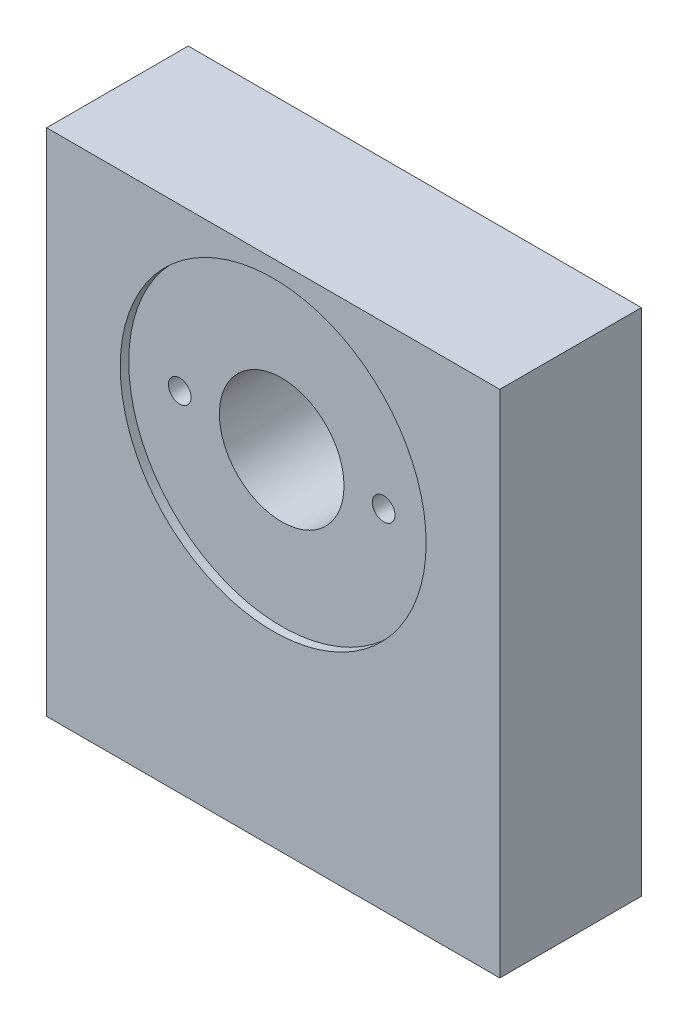
ISO-10303-21;
HEADER;
FILE_DESCRIPTION(('STEP AP214'),'2;1');
FILE_NAME('part.step','',(''),(''),'','','');
FILE_SCHEMA(('AUTOMOTIVE_DESIGN { 1 0 10303 214 1 1 1 1 }'));
ENDSEC;
DATA;
#1=APPLICATION_CONTEXT('core data for automotive mechanical design processes');
#2=APPLICATION_PROTOCOL_DEFINITION('international standard','automotive_design',2000,#1);
#3=PRODUCT_CONTEXT('',#1,'mechanical');
#4=PRODUCT('Part','Part','',(#3));
#5=PRODUCT_RELATED_PRODUCT_CATEGORY('part','',(#4));
#6=PRODUCT_DEFINITION_FORMATION('','',#4);
#7=PRODUCT_DEFINITION_CONTEXT('part definition',#1,'design');
#8=PRODUCT_DEFINITION('design','',#6,#7);
#9=PRODUCT_DEFINITION_SHAPE('','',#8);
#10=(LENGTH_UNIT() NAMED_UNIT(*) SI_UNIT(.MILLI.,.METRE.));
#11=(NAMED_UNIT(*) PLANE_ANGLE_UNIT() SI_UNIT($,.RADIAN.));
#12=(NAMED_UNIT(*) SI_UNIT($,.STERADIAN.) SOLID_ANGLE_UNIT());
#13=UNCERTAINTY_MEASURE_WITH_UNIT(LENGTH_MEASURE(1.E-05),#10,'distance_accuracy_value','');
#14=(GEOMETRIC_REPRESENTATION_CONTEXT(3) GLOBAL_UNCERTAINTY_ASSIGNED_CONTEXT((#13)) GLOBAL_UNIT_ASSIGNED_CONTEXT((#10,
#11,#12)) REPRESENTATION_CONTEXT('',''));
#15=CARTESIAN_POINT('',(0.,0.,0.));
#16=DIRECTION('',(0.,0.,1.));
#17=DIRECTION('',(1.,0.,0.));
#18=AXIS2_PLACEMENT_3D('',#15,#16,#17);
#19=CARTESIAN_POINT('',(-18.,60.,-77.5));
#20=DIRECTION('',(0.,0.,1.));
#21=DIRECTION('',(1.,0.,0.));
#22=AXIS2_PLACEMENT_3D('',#19,#20,#21);
#23=CYLINDRICAL_SURFACE('',#22,2.);
#24=CARTESIAN_POINT('',(-18.,60.,-12.5));
#25=DIRECTION('',(0.,0.,1.));
#26=DIRECTION('',(1.,0.,0.));
#27=AXIS2_PLACEMENT_3D('',#24,#25,#26);
#28=CIRCLE('',#27,2.);
#29=CARTESIAN_POINT('',(-16.,60.,-12.5));
#30=VERTEX_POINT('',#29);
#31=EDGE_CURVE('E102',#30,#30,#28,.T.);
#32=CARTESIAN_POINT('',(-18.,60.,11.));
#33=DIRECTION('',(0.,0.,1.));
#34=DIRECTION('',(1.,0.,0.));
#35=AXIS2_PLACEMENT_3D('',#32,#33,#34);
#36=CIRCLE('',#35,2.);
#37=CARTESIAN_POINT('',(-16.,60.,11.));
#38=VERTEX_POINT('',#37);
#39=EDGE_CURVE('E125',#38,#38,#36,.T.);
#40=CARTESIAN_POINT('',(-16.,60.,-12.5));
#41=CARTESIAN_POINT('',(-16.,60.,-12.2552083333333));
#42=CARTESIAN_POINT('',(-16.,60.,-12.0104166666667));
#43=CARTESIAN_POINT('',(-16.,60.,-11.5208333333333));
#44=CARTESIAN_POINT('',(-16.,60.,-11.2760416666667));
#45=CARTESIAN_POINT('',(-16.,60.,-10.7864583333333));
#46=CARTESIAN_POINT('',(-16.,60.,-10.5416666666667));
#47=CARTESIAN_POINT('',(-16.,60.,-10.0520833333333));
#48=CARTESIAN_POINT('',(-16.,60.,-9.80729166666667));
#49=CARTESIAN_POINT('',(-16.,60.,-9.31770833333334));
#50=CARTESIAN_POINT('',(-16.,60.,-9.07291666666667));
#51=CARTESIAN_POINT('',(-16.,60.,-8.58333333333334));
#52=CARTESIAN_POINT('',(-16.,60.,-8.33854166666668));
#53=CARTESIAN_POINT('',(-16.,60.,-7.84895833333334));
#54=CARTESIAN_POINT('',(-16.,60.,-7.60416666666667));
#55=CARTESIAN_POINT('',(-16.,60.,-7.11458333333334));
#56=CARTESIAN_POINT('',(-16.,60.,-6.86979166666667));
#57=CARTESIAN_POINT('',(-16.,60.,-6.38020833333334));
#58=CARTESIAN_POINT('',(-16.,60.,-6.13541666666667));
#59=CARTESIAN_POINT('',(-16.,60.,-5.64583333333334));
#60=CARTESIAN_POINT('',(-16.,60.,-5.40104166666667));
#61=CARTESIAN_POINT('',(-16.,60.,-4.91145833333334));
#62=CARTESIAN_POINT('',(-16.,60.,-4.66666666666667));
#63=CARTESIAN_POINT('',(-16.,60.,-4.17708333333334));
#64=CARTESIAN_POINT('',(-16.,60.,-3.93229166666667));
#65=CARTESIAN_POINT('',(-16.,60.,-3.44270833333334));
#66=CARTESIAN_POINT('',(-16.,60.,-3.19791666666667));
#67=CARTESIAN_POINT('',(-16.,60.,-2.70833333333334));
#68=CARTESIAN_POINT('',(-16.,60.,-2.46354166666667));
#69=CARTESIAN_POINT('',(-16.,60.,-1.97395833333334));
#70=CARTESIAN_POINT('',(-16.,60.,-1.72916666666667));
#71=CARTESIAN_POINT('',(-16.,60.,-1.23958333333333));
#72=CARTESIAN_POINT('',(-16.,60.,-0.994791666666666));
#73=CARTESIAN_POINT('',(-16.,60.,-0.505208333333336));
#74=CARTESIAN_POINT('',(-16.,60.,-0.26041666666667));
#75=CARTESIAN_POINT('',(-16.,60.,0.229166666666665));
#76=CARTESIAN_POINT('',(-16.,60.,0.473958333333334));
#77=CARTESIAN_POINT('',(-16.,60.,0.963541666666669));
#78=CARTESIAN_POINT('',(-16.,60.,1.20833333333333));
#79=CARTESIAN_POINT('',(-16.,60.,1.69791666666667));
#80=CARTESIAN_POINT('',(-16.,60.,1.94270833333334));
#81=CARTESIAN_POINT('',(-16.,60.,2.43229166666667));
#82=CARTESIAN_POINT('',(-16.,60.,2.67708333333334));
#83=CARTESIAN_POINT('',(-16.,60.,3.16666666666667));
#84=CARTESIAN_POINT('',(-16.,60.,3.41145833333333));
#85=CARTESIAN_POINT('',(-16.,60.,3.90104166666667));
#86=CARTESIAN_POINT('',(-16.,60.,4.14583333333334));
#87=CARTESIAN_POINT('',(-16.,60.,4.63541666666667));
#88=CARTESIAN_POINT('',(-16.,60.,4.88020833333334));
#89=CARTESIAN_POINT('',(-16.,60.,5.36979166666667));
#90=CARTESIAN_POINT('',(-16.,60.,5.61458333333333));
#91=CARTESIAN_POINT('',(-16.,60.,6.10416666666667));
#92=CARTESIAN_POINT('',(-16.,60.,6.34895833333334));
#93=CARTESIAN_POINT('',(-16.,60.,6.83854166666667));
#94=CARTESIAN_POINT('',(-16.,60.,7.08333333333334));
#95=CARTESIAN_POINT('',(-16.,60.,7.57291666666667));
#96=CARTESIAN_POINT('',(-16.,60.,7.81770833333333));
#97=CARTESIAN_POINT('',(-16.,60.,8.30729166666667));
#98=CARTESIAN_POINT('',(-16.,60.,8.55208333333334));
#99=CARTESIAN_POINT('',(-16.,60.,9.04166666666667));
#100=CARTESIAN_POINT('',(-16.,60.,9.28645833333334));
#101=CARTESIAN_POINT('',(-16.,60.,9.77604166666667));
#102=CARTESIAN_POINT('',(-16.,60.,10.0208333333333));
#103=CARTESIAN_POINT('',(-16.,60.,10.5104166666667));
#104=CARTESIAN_POINT('',(-16.,60.,10.7552083333333));
#105=CARTESIAN_POINT('',(-16.,60.,11.));
#106=B_SPLINE_CURVE_WITH_KNOTS('',3,(#40,#41,#42,#43,#44,#45,#46,#47,#48,#49,#50,#51,#52,#53,
#54,#55,#56,#57,#58,#59,#60,#61,#62,#63,#64,#65,#66,#67,#68,#69,#70,#71,#72,#73,#74,#75,#76,#77,
#78,#79,#80,#81,#82,#83,#84,#85,#86,#87,#88,#89,#90,#91,#92,#93,#94,#95,#96,#97,#98,#99,#100,
#101,#102,#103,#104,#105),.UNSPECIFIED.,.F.,.F.,(4,2,2,2,2,2,2,2,2,2,2,2,2,2,2,2,2,2,2,2,2,2,2,
2,2,2,2,2,2,2,2,2,4),(0.,0.734374999999995,1.46875,2.203125,2.93750000000001,3.671875,4.40625,
5.14062500000001,5.87500000000001,6.609375,7.34375000000001,8.07812500000001,8.8125,
9.54687500000001,10.28125,11.015625,11.75,12.484375,13.21875,13.953125,14.6875,15.421875,
16.15625,16.890625,17.625,18.359375,19.09375,19.828125,20.5625,21.296875,22.03125,22.765625,
23.5),.UNSPECIFIED.);
#107=EDGE_CURVE('BSEAM34',#30,#38,#106,.T.);
#108=ORIENTED_EDGE('',*,*,#31,.F.);
#109=ORIENTED_EDGE('',*,*,#39,.T.);
#110=ORIENTED_EDGE('',*,*,#107,.T.);
#111=ORIENTED_EDGE('',*,*,#107,.F.);
#112=EDGE_LOOP('',(#108,#110,#109,#111));
#113=FACE_BOUND('',#112,.T.);
#114=ADVANCED_FACE('F34',(#113),#23,.F.);
#115=CARTESIAN_POINT('',(0.,60.,-77.5));
#116=DIRECTION('',(0.,0.,1.));
#117=DIRECTION('',(1.,0.,0.));
#118=AXIS2_PLACEMENT_3D('',#115,#116,#117);
#119=CYLINDRICAL_SURFACE('',#118,11.);
#120=CARTESIAN_POINT('',(0.,60.,-12.5));
#121=DIRECTION('',(0.,0.,1.));
#122=DIRECTION('',(1.,0.,0.));
#123=AXIS2_PLACEMENT_3D('',#120,#121,#122);
#124=CIRCLE('',#123,11.);
#125=CARTESIAN_POINT('',(11.,60.,-12.5));
#126=VERTEX_POINT('',#125);
#127=EDGE_CURVE('E115',#126,#126,#124,.T.);
#128=CARTESIAN_POINT('',(0.,60.,11.));
#129=DIRECTION('',(0.,0.,1.));
#130=DIRECTION('',(1.,0.,0.));
#131=AXIS2_PLACEMENT_3D('',#128,#129,#130);
#132=CIRCLE('',#131,11.);
#133=CARTESIAN_POINT('',(11.,60.,11.));
#134=VERTEX_POINT('',#133);
#135=EDGE_CURVE('E130',#134,#134,#132,.T.);
#136=CARTESIAN_POINT('',(11.,60.,-12.5));
#137=CARTESIAN_POINT('',(11.,60.,-12.2552083333333));
#138=CARTESIAN_POINT('',(11.,60.,-12.0104166666667));
#139=CARTESIAN_POINT('',(11.,60.,-11.5208333333333));
#140=CARTESIAN_POINT('',(11.,60.,-11.2760416666667));
#141=CARTESIAN_POINT('',(11.,60.,-10.7864583333333));
#142=CARTESIAN_POINT('',(11.,60.,-10.5416666666667));
#143=CARTESIAN_POINT('',(11.,60.,-10.0520833333333));
#144=CARTESIAN_POINT('',(11.,60.,-9.80729166666667));
#145=CARTESIAN_POINT('',(11.,60.,-9.31770833333334));
#146=CARTESIAN_POINT('',(11.,60.,-9.07291666666667));
#147=CARTESIAN_POINT('',(11.,60.,-8.58333333333334));
#148=CARTESIAN_POINT('',(11.,60.,-8.33854166666668));
#149=CARTESIAN_POINT('',(11.,60.,-7.84895833333334));
#150=CARTESIAN_POINT('',(11.,60.,-7.60416666666667));
#151=CARTESIAN_POINT('',(11.,60.,-7.11458333333334));
#152=CARTESIAN_POINT('',(11.,60.,-6.86979166666667));
#153=CARTESIAN_POINT('',(11.,60.,-6.38020833333334));
#154=CARTESIAN_POINT('',(11.,60.,-6.13541666666667));
#155=CARTESIAN_POINT('',(11.,60.,-5.64583333333334));
#156=CARTESIAN_POINT('',(11.,60.,-5.40104166666667));
#157=CARTESIAN_POINT('',(11.,60.,-4.91145833333334));
#158=CARTESIAN_POINT('',(11.,60.,-4.66666666666667));
#159=CARTESIAN_POINT('',(11.,60.,-4.17708333333334));
#160=CARTESIAN_POINT('',(11.,60.,-3.93229166666667));
#161=CARTESIAN_POINT('',(11.,60.,-3.44270833333334));
#162=CARTESIAN_POINT('',(11.,60.,-3.19791666666667));
#163=CARTESIAN_POINT('',(11.,60.,-2.70833333333334));
#164=CARTESIAN_POINT('',(11.,60.,-2.46354166666667));
#165=CARTESIAN_POINT('',(11.,60.,-1.97395833333334));
#166=CARTESIAN_POINT('',(11.,60.,-1.72916666666667));
#167=CARTESIAN_POINT('',(11.,60.,-1.23958333333333));
#168=CARTESIAN_POINT('',(11.,60.,-0.994791666666666));
#169=CARTESIAN_POINT('',(11.,60.,-0.505208333333336));
#170=CARTESIAN_POINT('',(11.,60.,-0.26041666666667));
#171=CARTESIAN_POINT('',(11.,60.,0.229166666666665));
#172=CARTESIAN_POINT('',(11.,60.,0.473958333333334));
#173=CARTESIAN_POINT('',(11.,60.,0.963541666666669));
#174=CARTESIAN_POINT('',(11.,60.,1.20833333333333));
#175=CARTESIAN_POINT('',(11.,60.,1.69791666666667));
#176=CARTESIAN_POINT('',(11.,60.,1.94270833333334));
#177=CARTESIAN_POINT('',(11.,60.,2.43229166666667));
#178=CARTESIAN_POINT('',(11.,60.,2.67708333333334));
#179=CARTESIAN_POINT('',(11.,60.,3.16666666666667));
#180=CARTESIAN_POINT('',(11.,60.,3.41145833333333));
#181=CARTESIAN_POINT('',(11.,60.,3.90104166666667));
#182=CARTESIAN_POINT('',(11.,60.,4.14583333333334));
#183=CARTESIAN_POINT('',(11.,60.,4.63541666666667));
#184=CARTESIAN_POINT('',(11.,60.,4.88020833333334));
#185=CARTESIAN_POINT('',(11.,60.,5.36979166666667));
#186=CARTESIAN_POINT('',(11.,60.,5.61458333333333));
#187=CARTESIAN_POINT('',(11.,60.,6.10416666666667));
#188=CARTESIAN_POINT('',(11.,60.,6.34895833333334));
#189=CARTESIAN_POINT('',(11.,60.,6.83854166666667));
#190=CARTESIAN_POINT('',(11.,60.,7.08333333333334));
#191=CARTESIAN_POINT('',(11.,60.,7.57291666666667));
#192=CARTESIAN_POINT('',(11.,60.,7.81770833333333));
#193=CARTESIAN_POINT('',(11.,60.,8.30729166666667));
#194=CARTESIAN_POINT('',(11.,60.,8.55208333333334));
#195=CARTESIAN_POINT('',(11.,60.,9.04166666666667));
#196=CARTESIAN_POINT('',(11.,60.,9.28645833333334));
#197=CARTESIAN_POINT('',(11.,60.,9.77604166666667));
#198=CARTESIAN_POINT('',(11.,60.,10.0208333333333));
#199=CARTESIAN_POINT('',(11.,60.,10.5104166666667));
#200=CARTESIAN_POINT('',(11.,60.,10.7552083333333));
#201=CARTESIAN_POINT('',(11.,60.,11.));
#202=B_SPLINE_CURVE_WITH_KNOTS('',3,(#136,#137,#138,#139,#140,#141,#142,#143,#144,#145,#146,
#147,#148,#149,#150,#151,#152,#153,#154,#155,#156,#157,#158,#159,#160,#161,#162,#163,#164,#165,
#166,#167,#168,#169,#170,#171,#172,#173,#174,#175,#176,#177,#178,#179,#180,#181,#182,#183,#184,
#185,#186,#187,#188,#189,#190,#191,#192,#193,#194,#195,#196,#197,#198,#199,#200,#201),
.UNSPECIFIED.,.F.,.F.,(4,2,2,2,2,2,2,2,2,2,2,2,2,2,2,2,2,2,2,2,2,2,2,2,2,2,2,2,2,2,2,2,4),(0.,
0.734374999999995,1.46875,2.203125,2.93750000000001,3.671875,4.40625,5.14062500000001,
5.87500000000001,6.609375,7.34375000000001,8.07812500000001,8.8125,9.54687500000001,10.28125,
11.015625,11.75,12.484375,13.21875,13.953125,14.6875,15.421875,16.15625,16.890625,17.625,
18.359375,19.09375,19.828125,20.5625,21.296875,22.03125,22.765625,23.5),.UNSPECIFIED.);
#203=EDGE_CURVE('BSEAM164',#126,#134,#202,.T.);
#204=ORIENTED_EDGE('',*,*,#127,.F.);
#205=ORIENTED_EDGE('',*,*,#135,.T.);
#206=ORIENTED_EDGE('',*,*,#203,.T.);
#207=ORIENTED_EDGE('',*,*,#203,.F.);
#208=EDGE_LOOP('',(#204,#206,#205,#207));
#209=FACE_BOUND('',#208,.T.);
#210=ADVANCED_FACE('F164',(#209),#119,.F.);
#211=CARTESIAN_POINT('',(18.,60.,-77.5));
#212=DIRECTION('',(0.,0.,1.));
#213=DIRECTION('',(1.,0.,0.));
#214=AXIS2_PLACEMENT_3D('',#211,#212,#213);
#215=CYLINDRICAL_SURFACE('',#214,2.);
#216=CARTESIAN_POINT('',(18.,60.,-12.5));
#217=DIRECTION('',(0.,0.,1.));
#218=DIRECTION('',(1.,0.,0.));
#219=AXIS2_PLACEMENT_3D('',#216,#217,#218);
#220=CIRCLE('',#219,2.);
#221=CARTESIAN_POINT('',(20.,60.,-12.5));
#222=VERTEX_POINT('',#221);
#223=EDGE_CURVE('E118',#222,#222,#220,.F.);
#224=CARTESIAN_POINT('',(18.,60.,11.));
#225=DIRECTION('',(0.,0.,1.));
#226=DIRECTION('',(-1.,0.,0.));
#227=AXIS2_PLACEMENT_3D('',#224,#225,#226);
#228=CIRCLE('',#227,2.);
#229=CARTESIAN_POINT('',(20.,60.,11.));
#230=VERTEX_POINT('',#229);
#231=EDGE_CURVE('E133',#230,#230,#228,.T.);
#232=CARTESIAN_POINT('',(20.,60.,-12.5));
#233=CARTESIAN_POINT('',(20.,60.,-12.2552083333333));
#234=CARTESIAN_POINT('',(20.,60.,-12.0104166666667));
#235=CARTESIAN_POINT('',(20.,60.,-11.5208333333333));
#236=CARTESIAN_POINT('',(20.,60.,-11.2760416666667));
#237=CARTESIAN_POINT('',(20.,60.,-10.7864583333333));
#238=CARTESIAN_POINT('',(20.,60.,-10.5416666666667));
#239=CARTESIAN_POINT('',(20.,60.,-10.0520833333333));
#240=CARTESIAN_POINT('',(20.,60.,-9.80729166666667));
#241=CARTESIAN_POINT('',(20.,60.,-9.31770833333334));
#242=CARTESIAN_POINT('',(20.,60.,-9.07291666666667));
#243=CARTESIAN_POINT('',(20.,60.,-8.58333333333334));
#244=CARTESIAN_POINT('',(20.,60.,-8.33854166666668));
#245=CARTESIAN_POINT('',(20.,60.,-7.84895833333334));
#246=CARTESIAN_POINT('',(20.,60.,-7.60416666666667));
#247=CARTESIAN_POINT('',(20.,60.,-7.11458333333334));
#248=CARTESIAN_POINT('',(20.,60.,-6.86979166666667));
#249=CARTESIAN_POINT('',(20.,60.,-6.38020833333334));
#250=CARTESIAN_POINT('',(20.,60.,-6.13541666666667));
#251=CARTESIAN_POINT('',(20.,60.,-5.64583333333334));
#252=CARTESIAN_POINT('',(20.,60.,-5.40104166666667));
#253=CARTESIAN_POINT('',(20.,60.,-4.91145833333334));
#254=CARTESIAN_POINT('',(20.,60.,-4.66666666666667));
#255=CARTESIAN_POINT('',(20.,60.,-4.17708333333334));
#256=CARTESIAN_POINT('',(20.,60.,-3.93229166666667));
#257=CARTESIAN_POINT('',(20.,60.,-3.44270833333334));
#258=CARTESIAN_POINT('',(20.,60.,-3.19791666666667));
#259=CARTESIAN_POINT('',(20.,60.,-2.70833333333334));
#260=CARTESIAN_POINT('',(20.,60.,-2.46354166666667));
#261=CARTESIAN_POINT('',(20.,60.,-1.97395833333334));
#262=CARTESIAN_POINT('',(20.,60.,-1.72916666666667));
#263=CARTESIAN_POINT('',(20.,60.,-1.23958333333333));
#264=CARTESIAN_POINT('',(20.,60.,-0.994791666666666));
#265=CARTESIAN_POINT('',(20.,60.,-0.505208333333336));
#266=CARTESIAN_POINT('',(20.,60.,-0.26041666666667));
#267=CARTESIAN_POINT('',(20.,60.,0.229166666666665));
#268=CARTESIAN_POINT('',(20.,60.,0.473958333333334));
#269=CARTESIAN_POINT('',(20.,60.,0.963541666666669));
#270=CARTESIAN_POINT('',(20.,60.,1.20833333333333));
#271=CARTESIAN_POINT('',(20.,60.,1.69791666666667));
#272=CARTESIAN_POINT('',(20.,60.,1.94270833333334));
#273=CARTESIAN_POINT('',(20.,60.,2.43229166666667));
#274=CARTESIAN_POINT('',(20.,60.,2.67708333333334));
#275=CARTESIAN_POINT('',(20.,60.,3.16666666666667));
#276=CARTESIAN_POINT('',(20.,60.,3.41145833333333));
#277=CARTESIAN_POINT('',(20.,60.,3.90104166666667));
#278=CARTESIAN_POINT('',(20.,60.,4.14583333333334));
#279=CARTESIAN_POINT('',(20.,60.,4.63541666666667));
#280=CARTESIAN_POINT('',(20.,60.,4.88020833333334));
#281=CARTESIAN_POINT('',(20.,60.,5.36979166666667));
#282=CARTESIAN_POINT('',(20.,60.,5.61458333333333));
#283=CARTESIAN_POINT('',(20.,60.,6.10416666666667));
#284=CARTESIAN_POINT('',(20.,60.,6.34895833333334));
#285=CARTESIAN_POINT('',(20.,60.,6.83854166666667));
#286=CARTESIAN_POINT('',(20.,60.,7.08333333333334));
#287=CARTESIAN_POINT('',(20.,60.,7.57291666666667));
#288=CARTESIAN_POINT('',(20.,60.,7.81770833333333));
#289=CARTESIAN_POINT('',(20.,60.,8.30729166666667));
#290=CARTESIAN_POINT('',(20.,60.,8.55208333333334));
#291=CARTESIAN_POINT('',(20.,60.,9.04166666666667));
#292=CARTESIAN_POINT('',(20.,60.,9.28645833333334));
#293=CARTESIAN_POINT('',(20.,60.,9.77604166666667));
#294=CARTESIAN_POINT('',(20.,60.,10.0208333333333));
#295=CARTESIAN_POINT('',(20.,60.,10.5104166666667));
#296=CARTESIAN_POINT('',(20.,60.,10.7552083333333));
#297=CARTESIAN_POINT('',(20.,60.,11.));
#298=B_SPLINE_CURVE_WITH_KNOTS('',3,(#232,#233,#234,#235,#236,#237,#238,#239,#240,#241,#242,
#243,#244,#245,#246,#247,#248,#249,#250,#251,#252,#253,#254,#255,#256,#257,#258,#259,#260,#261,
#262,#263,#264,#265,#266,#267,#268,#269,#270,#271,#272,#273,#274,#275,#276,#277,#278,#279,#280,
#281,#282,#283,#284,#285,#286,#287,#288,#289,#290,#291,#292,#293,#294,#295,#296,#297),
.UNSPECIFIED.,.F.,.F.,(4,2,2,2,2,2,2,2,2,2,2,2,2,2,2,2,2,2,2,2,2,2,2,2,2,2,2,2,2,2,2,2,4),(0.,
0.734374999999995,1.46875,2.203125,2.93750000000001,3.671875,4.40625,5.14062500000001,
5.87500000000001,6.609375,7.34375000000001,8.07812500000001,8.8125,9.54687500000001,10.28125,
11.015625,11.75,12.484375,13.21875,13.953125,14.6875,15.421875,16.15625,16.890625,17.625,
18.359375,19.09375,19.828125,20.5625,21.296875,22.03125,22.765625,23.5),.UNSPECIFIED.);
#299=EDGE_CURVE('BSEAM137',#222,#230,#298,.T.);
#300=ORIENTED_EDGE('',*,*,#223,.T.);
#301=ORIENTED_EDGE('',*,*,#231,.T.);
#302=ORIENTED_EDGE('',*,*,#299,.T.);
#303=ORIENTED_EDGE('',*,*,#299,.F.);
#304=EDGE_LOOP('',(#300,#302,#301,#303));
#305=FACE_BOUND('',#304,.T.);
#306=ADVANCED_FACE('F137',(#305),#215,.F.);
#307=CARTESIAN_POINT('',(-40.,90.,-12.5));
#308=DIRECTION('',(0.,0.,1.));
#309=DIRECTION('',(1.,0.,0.));
#310=AXIS2_PLACEMENT_3D('',#307,#308,#309);
#311=PLANE('',#310);
#312=DIRECTION('',(-1.,0.,0.));
#313=VECTOR('',#312,1.);
#314=CARTESIAN_POINT('',(-40.,0.,-12.5));
#315=LINE('',#314,#313);
#316=CARTESIAN_POINT('',(40.,0.,-12.5));
#317=VERTEX_POINT('',#316);
#318=CARTESIAN_POINT('',(-40.,0.,-12.5));
#319=VERTEX_POINT('',#318);
#320=EDGE_CURVE('E91',#317,#319,#315,.T.);
#321=ORIENTED_EDGE('',*,*,#320,.T.);
#322=DIRECTION('',(0.,-1.,0.));
#323=VECTOR('',#322,1.);
#324=CARTESIAN_POINT('',(-40.,90.,-12.5));
#325=LINE('',#324,#323);
#326=CARTESIAN_POINT('',(-40.,90.,-12.5));
#327=VERTEX_POINT('',#326);
#328=EDGE_CURVE('E43',#327,#319,#325,.T.);
#329=ORIENTED_EDGE('',*,*,#328,.F.);
#330=DIRECTION('',(-1.,0.,0.));
#331=VECTOR('',#330,1.);
#332=CARTESIAN_POINT('',(-40.,90.,-12.5));
#333=LINE('',#332,#331);
#334=CARTESIAN_POINT('',(40.,90.,-12.5));
#335=VERTEX_POINT('',#334);
#336=EDGE_CURVE('E81',#335,#327,#333,.T.);
#337=ORIENTED_EDGE('',*,*,#336,.F.);
#338=DIRECTION('',(0.,-1.,0.));
#339=VECTOR('',#338,1.);
#340=CARTESIAN_POINT('',(40.,90.,-12.5));
#341=LINE('',#340,#339);
#342=EDGE_CURVE('E11',#335,#317,#341,.T.);
#343=ORIENTED_EDGE('',*,*,#342,.T.);
#344=EDGE_LOOP('',(#321,#329,#337,#343));
#345=FACE_BOUND('',#344,.T.);
#346=ORIENTED_EDGE('',*,*,#31,.T.);
#347=EDGE_LOOP('',(#346));
#348=FACE_BOUND('',#347,.T.);
#349=ORIENTED_EDGE('',*,*,#127,.T.);
#350=EDGE_LOOP('',(#349));
#351=FACE_BOUND('',#350,.T.);
#352=ORIENTED_EDGE('',*,*,#223,.F.);
#353=EDGE_LOOP('',(#352));
#354=FACE_BOUND('',#353,.T.);
#355=ADVANCED_FACE('F89',(#345,#348,#351,#354),#311,.F.);
#356=CARTESIAN_POINT('',(-40.,90.,12.5));
#357=DIRECTION('',(0.,0.,-1.));
#358=DIRECTION('',(-1.,0.,0.));
#359=AXIS2_PLACEMENT_3D('',#356,#357,#358);
#360=PLANE('',#359);
#361=CARTESIAN_POINT('',(0.,60.,12.5));
#362=DIRECTION('',(0.,0.,1.));
#363=DIRECTION('',(1.,0.,0.));
#364=AXIS2_PLACEMENT_3D('',#361,#362,#363);
#365=CIRCLE('',#364,27.);
#366=CARTESIAN_POINT('',(27.,60.,12.5));
#367=VERTEX_POINT('',#366);
#368=EDGE_CURVE('E122',#367,#367,#365,.T.);
#369=ORIENTED_EDGE('',*,*,#368,.F.);
#370=EDGE_LOOP('',(#369));
#371=FACE_BOUND('',#370,.T.);
#372=DIRECTION('',(1.,0.,0.));
#373=VECTOR('',#372,1.);
#374=CARTESIAN_POINT('',(-40.,0.,12.5));
#375=LINE('',#374,#373);
#376=CARTESIAN_POINT('',(-40.,0.,12.5));
#377=VERTEX_POINT('',#376);
#378=CARTESIAN_POINT('',(40.,0.,12.5));
#379=VERTEX_POINT('',#378);
#380=EDGE_CURVE('E74',#377,#379,#375,.T.);
#381=ORIENTED_EDGE('',*,*,#380,.T.);
#382=DIRECTION('',(0.,-1.,0.));
#383=VECTOR('',#382,1.);
#384=CARTESIAN_POINT('',(40.,90.,12.5));
#385=LINE('',#384,#383);
#386=CARTESIAN_POINT('',(40.,90.,12.5));
#387=VERTEX_POINT('',#386);
#388=EDGE_CURVE('E95',#387,#379,#385,.T.);
#389=ORIENTED_EDGE('',*,*,#388,.F.);
#390=DIRECTION('',(1.,0.,0.));
#391=VECTOR('',#390,1.);
#392=CARTESIAN_POINT('',(-40.,90.,12.5));
#393=LINE('',#392,#391);
#394=CARTESIAN_POINT('',(-40.,90.,12.5));
#395=VERTEX_POINT('',#394);
#396=EDGE_CURVE('E51',#395,#387,#393,.T.);
#397=ORIENTED_EDGE('',*,*,#396,.F.);
#398=DIRECTION('',(0.,-1.,0.));
#399=VECTOR('',#398,1.);
#400=CARTESIAN_POINT('',(-40.,90.,12.5));
#401=LINE('',#400,#399);
#402=EDGE_CURVE('E92',#395,#377,#401,.T.);
#403=ORIENTED_EDGE('',*,*,#402,.T.);
#404=EDGE_LOOP('',(#381,#389,#397,#403));
#405=FACE_BOUND('',#404,.T.);
#406=ADVANCED_FACE('F107',(#371,#405),#360,.F.);
#407=CARTESIAN_POINT('',(40.,90.,12.5));
#408=DIRECTION('',(-1.,0.,0.));
#409=DIRECTION('',(0.,0.,1.));
#410=AXIS2_PLACEMENT_3D('',#407,#408,#409);
#411=PLANE('',#410);
#412=DIRECTION('',(0.,0.,-1.));
#413=VECTOR('',#412,1.);
#414=CARTESIAN_POINT('',(40.,0.,12.5));
#415=LINE('',#414,#413);
#416=EDGE_CURVE('E99',#379,#317,#415,.T.);
#417=ORIENTED_EDGE('',*,*,#416,.T.);
#418=ORIENTED_EDGE('',*,*,#342,.F.);
#419=DIRECTION('',(0.,0.,-1.));
#420=VECTOR('',#419,1.);
#421=CARTESIAN_POINT('',(40.,90.,12.5));
#422=LINE('',#421,#420);
#423=EDGE_CURVE('E86',#387,#335,#422,.T.);
#424=ORIENTED_EDGE('',*,*,#423,.F.);
#425=ORIENTED_EDGE('',*,*,#388,.T.);
#426=EDGE_LOOP('',(#417,#418,#424,#425));
#427=FACE_BOUND('',#426,.T.);
#428=ADVANCED_FACE('F36',(#427),#411,.F.);
#429=CARTESIAN_POINT('',(-40.,90.,12.5));
#430=DIRECTION('',(1.,0.,0.));
#431=DIRECTION('',(0.,0.,-1.));
#432=AXIS2_PLACEMENT_3D('',#429,#430,#431);
#433=PLANE('',#432);
#434=DIRECTION('',(0.,0.,1.));
#435=VECTOR('',#434,1.);
#436=CARTESIAN_POINT('',(-40.,0.,12.5));
#437=LINE('',#436,#435);
#438=EDGE_CURVE('E68',#319,#377,#437,.T.);
#439=ORIENTED_EDGE('',*,*,#438,.T.);
#440=ORIENTED_EDGE('',*,*,#402,.F.);
#441=DIRECTION('',(0.,0.,1.));
#442=VECTOR('',#441,1.);
#443=CARTESIAN_POINT('',(-40.,90.,12.5));
#444=LINE('',#443,#442);
#445=EDGE_CURVE('E84',#327,#395,#444,.T.);
#446=ORIENTED_EDGE('',*,*,#445,.F.);
#447=ORIENTED_EDGE('',*,*,#328,.T.);
#448=EDGE_LOOP('',(#439,#440,#446,#447));
#449=FACE_BOUND('',#448,.T.);
#450=ADVANCED_FACE('F93',(#449),#433,.F.);
#451=CARTESIAN_POINT('',(0.,90.,0.));
#452=DIRECTION('',(0.,-1.,0.));
#453=DIRECTION('',(0.,0.,-1.));
#454=AXIS2_PLACEMENT_3D('',#451,#452,#453);
#455=PLANE('',#454);
#456=ORIENTED_EDGE('',*,*,#423,.T.);
#457=ORIENTED_EDGE('',*,*,#336,.T.);
#458=ORIENTED_EDGE('',*,*,#445,.T.);
#459=ORIENTED_EDGE('',*,*,#396,.T.);
#460=EDGE_LOOP('',(#456,#457,#458,#459));
#461=FACE_BOUND('',#460,.T.);
#462=ADVANCED_FACE('F82',(#461),#455,.F.);
#463=CARTESIAN_POINT('',(0.,0.,0.));
#464=DIRECTION('',(0.,-1.,0.));
#465=DIRECTION('',(0.,0.,-1.));
#466=AXIS2_PLACEMENT_3D('',#463,#464,#465);
#467=PLANE('',#466);
#468=ORIENTED_EDGE('',*,*,#416,.F.);
#469=ORIENTED_EDGE('',*,*,#380,.F.);
#470=ORIENTED_EDGE('',*,*,#438,.F.);
#471=ORIENTED_EDGE('',*,*,#320,.F.);
#472=EDGE_LOOP('',(#468,#469,#470,#471));
#473=FACE_BOUND('',#472,.T.);
#474=ADVANCED_FACE('F110',(#473),#467,.T.);
#475=CARTESIAN_POINT('',(0.,60.,11.));
#476=DIRECTION('',(0.,0.,1.));
#477=DIRECTION('',(1.,0.,0.));
#478=AXIS2_PLACEMENT_3D('',#475,#476,#477);
#479=CYLINDRICAL_SURFACE('',#478,27.);
#480=CARTESIAN_POINT('',(0.,60.,11.));
#481=DIRECTION('',(0.,0.,1.));
#482=DIRECTION('',(1.,0.,0.));
#483=AXIS2_PLACEMENT_3D('',#480,#481,#482);
#484=CIRCLE('',#483,27.);
#485=CARTESIAN_POINT('',(27.,60.,11.));
#486=VERTEX_POINT('',#485);
#487=EDGE_CURVE('E121',#486,#486,#484,.T.);
#488=ORIENTED_EDGE('',*,*,#487,.F.);
#489=EDGE_LOOP('',(#488));
#490=FACE_BOUND('',#489,.T.);
#491=ORIENTED_EDGE('',*,*,#368,.T.);
#492=EDGE_LOOP('',(#491));
#493=FACE_BOUND('',#492,.T.);
#494=ADVANCED_FACE('F142',(#490,#493),#479,.F.);
#495=CARTESIAN_POINT('',(0.,60.,11.));
#496=DIRECTION('',(0.,0.,1.));
#497=DIRECTION('',(1.,0.,0.));
#498=AXIS2_PLACEMENT_3D('',#495,#496,#497);
#499=PLANE('',#498);
#500=ORIENTED_EDGE('',*,*,#231,.F.);
#501=EDGE_LOOP('',(#500));
#502=FACE_BOUND('',#501,.T.);
#503=ORIENTED_EDGE('',*,*,#135,.F.);
#504=EDGE_LOOP('',(#503));
#505=FACE_BOUND('',#504,.T.);
#506=ORIENTED_EDGE('',*,*,#39,.F.);
#507=EDGE_LOOP('',(#506));
#508=FACE_BOUND('',#507,.T.);
#509=ORIENTED_EDGE('',*,*,#487,.T.);
#510=EDGE_LOOP('',(#509));
#511=FACE_BOUND('',#510,.T.);
#512=ADVANCED_FACE('F139',(#502,#505,#508,#511),#499,.T.);
#513=CLOSED_SHELL('',(#114,#210,#306,#355,#406,#428,#450,#462,#474,#494,#512));
#514=MANIFOLD_SOLID_BREP('B2',#513);
#515=ADVANCED_BREP_SHAPE_REPRESENTATION('',(#18,#514),#14);
#516=SHAPE_DEFINITION_REPRESENTATION(#9,#515);
ENDSEC;
END-ISO-10303-21;
